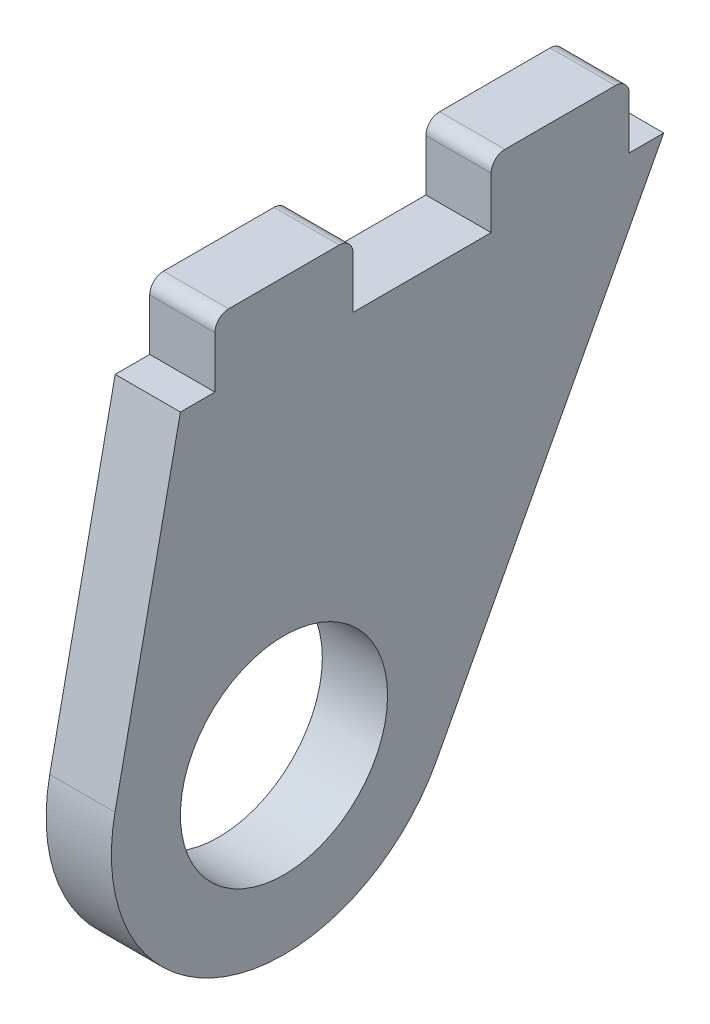
ISO-10303-21;
HEADER;
FILE_DESCRIPTION(('STEP AP214'),'2;1');
FILE_NAME('part.step','',(''),(''),'','','');
FILE_SCHEMA(('AUTOMOTIVE_DESIGN { 1 0 10303 214 1 1 1 1 }'));
ENDSEC;
DATA;
#1=APPLICATION_CONTEXT('core data for automotive mechanical design processes');
#2=APPLICATION_PROTOCOL_DEFINITION('international standard','automotive_design',2000,#1);
#3=PRODUCT_CONTEXT('',#1,'mechanical');
#4=PRODUCT('Part','Part','',(#3));
#5=PRODUCT_RELATED_PRODUCT_CATEGORY('part','',(#4));
#6=PRODUCT_DEFINITION_FORMATION('','',#4);
#7=PRODUCT_DEFINITION_CONTEXT('part definition',#1,'design');
#8=PRODUCT_DEFINITION('design','',#6,#7);
#9=PRODUCT_DEFINITION_SHAPE('','',#8);
#10=(LENGTH_UNIT() NAMED_UNIT(*) SI_UNIT(.MILLI.,.METRE.));
#11=(NAMED_UNIT(*) PLANE_ANGLE_UNIT() SI_UNIT($,.RADIAN.));
#12=(NAMED_UNIT(*) SI_UNIT($,.STERADIAN.) SOLID_ANGLE_UNIT());
#13=UNCERTAINTY_MEASURE_WITH_UNIT(LENGTH_MEASURE(1.E-05),#10,'distance_accuracy_value','');
#14=(GEOMETRIC_REPRESENTATION_CONTEXT(3) GLOBAL_UNCERTAINTY_ASSIGNED_CONTEXT((#13)) GLOBAL_UNIT_ASSIGNED_CONTEXT((#10,
#11,#12)) REPRESENTATION_CONTEXT('',''));
#15=CARTESIAN_POINT('',(0.,0.,0.));
#16=DIRECTION('',(0.,0.,1.));
#17=DIRECTION('',(1.,0.,0.));
#18=AXIS2_PLACEMENT_3D('',#15,#16,#17);
#19=CARTESIAN_POINT('',(3.,32.1,9.525));
#20=DIRECTION('',(0.,-1.,0.));
#21=DIRECTION('',(0.,0.,-1.));
#22=AXIS2_PLACEMENT_3D('',#19,#20,#21);
#23=PLANE('',#22);
#24=DIRECTION('',(-1.,0.,0.));
#25=VECTOR('',#24,1.);
#26=CARTESIAN_POINT('',(-3.,32.1,-31.75));
#27=LINE('',#26,#25);
#28=CARTESIAN_POINT('',(3.,32.1,-31.75));
#29=VERTEX_POINT('',#28);
#30=CARTESIAN_POINT('',(-3.,32.1,-31.75));
#31=VERTEX_POINT('',#30);
#32=EDGE_CURVE('E190',#29,#31,#27,.T.);
#33=ORIENTED_EDGE('',*,*,#32,.F.);
#34=DIRECTION('',(0.,0.,1.));
#35=VECTOR('',#34,1.);
#36=CARTESIAN_POINT('',(3.,32.1,9.525));
#37=LINE('',#36,#35);
#38=CARTESIAN_POINT('',(3.,32.1,-34.925));
#39=VERTEX_POINT('',#38);
#40=EDGE_CURVE('E253',#39,#29,#37,.T.);
#41=ORIENTED_EDGE('',*,*,#40,.F.);
#42=DIRECTION('',(-1.,0.,0.));
#43=VECTOR('',#42,1.);
#44=CARTESIAN_POINT('',(3.,32.1,-34.925));
#45=LINE('',#44,#43);
#46=CARTESIAN_POINT('',(-3.,32.1,-34.925));
#47=VERTEX_POINT('',#46);
#48=EDGE_CURVE('E278',#39,#47,#45,.T.);
#49=ORIENTED_EDGE('',*,*,#48,.T.);
#50=DIRECTION('',(0.,0.,1.));
#51=VECTOR('',#50,1.);
#52=CARTESIAN_POINT('',(-3.,32.1,9.525));
#53=LINE('',#52,#51);
#54=EDGE_CURVE('E182',#47,#31,#53,.T.);
#55=ORIENTED_EDGE('',*,*,#54,.T.);
#56=EDGE_LOOP('',(#33,#41,#49,#55));
#57=FACE_BOUND('',#56,.T.);
#58=ADVANCED_FACE('F45',(#57),#23,.F.);
#59=DIRECTION('',(1.,0.,0.));
#60=VECTOR('',#59,1.);
#61=CARTESIAN_POINT('',(-3.,32.1,-19.05));
#62=LINE('',#61,#60);
#63=CARTESIAN_POINT('',(-3.,32.1,-19.05));
#64=VERTEX_POINT('',#63);
#65=CARTESIAN_POINT('',(3.,32.1,-19.05));
#66=VERTEX_POINT('',#65);
#67=EDGE_CURVE('E163',#64,#66,#62,.T.);
#68=ORIENTED_EDGE('',*,*,#67,.F.);
#69=CARTESIAN_POINT('',(-3.,32.1,-6.35));
#70=VERTEX_POINT('',#69);
#71=EDGE_CURVE('E172',#64,#70,#53,.T.);
#72=ORIENTED_EDGE('',*,*,#71,.T.);
#73=DIRECTION('',(-1.,0.,0.));
#74=VECTOR('',#73,1.);
#75=CARTESIAN_POINT('',(-3.,32.1,-6.35));
#76=LINE('',#75,#74);
#77=CARTESIAN_POINT('',(3.,32.1,-6.35));
#78=VERTEX_POINT('',#77);
#79=EDGE_CURVE('E208',#78,#70,#76,.T.);
#80=ORIENTED_EDGE('',*,*,#79,.F.);
#81=EDGE_CURVE('E187',#66,#78,#37,.T.);
#82=ORIENTED_EDGE('',*,*,#81,.F.);
#83=EDGE_LOOP('',(#68,#72,#80,#82));
#84=FACE_BOUND('',#83,.T.);
#85=ADVANCED_FACE('F186',(#84),#23,.F.);
#86=DIRECTION('',(1.,0.,0.));
#87=VECTOR('',#86,1.);
#88=CARTESIAN_POINT('',(-3.,32.1,6.35));
#89=LINE('',#88,#87);
#90=CARTESIAN_POINT('',(-3.,32.1,6.35));
#91=VERTEX_POINT('',#90);
#92=CARTESIAN_POINT('',(3.,32.1,6.35));
#93=VERTEX_POINT('',#92);
#94=EDGE_CURVE('E214',#91,#93,#89,.T.);
#95=ORIENTED_EDGE('',*,*,#94,.F.);
#96=CARTESIAN_POINT('',(-3.,32.1,9.525));
#97=VERTEX_POINT('',#96);
#98=EDGE_CURVE('E183',#91,#97,#53,.T.);
#99=ORIENTED_EDGE('',*,*,#98,.T.);
#100=DIRECTION('',(-1.,0.,0.));
#101=VECTOR('',#100,1.);
#102=CARTESIAN_POINT('',(3.,32.1,9.525));
#103=LINE('',#102,#101);
#104=CARTESIAN_POINT('',(3.,32.1,9.525));
#105=VERTEX_POINT('',#104);
#106=EDGE_CURVE('E274',#105,#97,#103,.T.);
#107=ORIENTED_EDGE('',*,*,#106,.F.);
#108=EDGE_CURVE('E252',#93,#105,#37,.T.);
#109=ORIENTED_EDGE('',*,*,#108,.F.);
#110=EDGE_LOOP('',(#95,#99,#107,#109));
#111=FACE_BOUND('',#110,.T.);
#112=ADVANCED_FACE('F373',(#111),#23,.F.);
#113=CARTESIAN_POINT('',(3.,0.,0.));
#114=DIRECTION('',(1.,0.,0.));
#115=DIRECTION('',(0.,0.,-1.));
#116=AXIS2_PLACEMENT_3D('',#113,#114,#115);
#117=PLANE('',#116);
#118=DIRECTION('',(0.,-1.,0.));
#119=VECTOR('',#118,1.);
#120=CARTESIAN_POINT('',(3.,38.1,-31.75));
#121=LINE('',#120,#119);
#122=CARTESIAN_POINT('',(3.,36.83,-31.75));
#123=VERTEX_POINT('',#122);
#124=EDGE_CURVE('E205',#123,#29,#121,.T.);
#125=ORIENTED_EDGE('',*,*,#124,.F.);
#126=CARTESIAN_POINT('',(3.,36.83,-30.48));
#127=DIRECTION('',(1.,0.,0.));
#128=DIRECTION('',(0.,0.,-1.));
#129=AXIS2_PLACEMENT_3D('',#126,#127,#128);
#130=CIRCLE('',#129,1.27);
#131=CARTESIAN_POINT('',(3.,38.1,-30.48));
#132=VERTEX_POINT('',#131);
#133=EDGE_CURVE('E54',#123,#132,#130,.T.);
#134=ORIENTED_EDGE('',*,*,#133,.T.);
#135=DIRECTION('',(0.,0.,-1.));
#136=VECTOR('',#135,1.);
#137=CARTESIAN_POINT('',(3.,38.1,-19.05));
#138=LINE('',#137,#136);
#139=CARTESIAN_POINT('',(3.,38.1,-20.32));
#140=VERTEX_POINT('',#139);
#141=EDGE_CURVE('E189',#140,#132,#138,.T.);
#142=ORIENTED_EDGE('',*,*,#141,.F.);
#143=CARTESIAN_POINT('',(3.,36.83,-20.32));
#144=DIRECTION('',(1.,0.,0.));
#145=DIRECTION('',(0.,0.,-1.));
#146=AXIS2_PLACEMENT_3D('',#143,#144,#145);
#147=CIRCLE('',#146,1.27);
#148=CARTESIAN_POINT('',(3.,36.83,-19.05));
#149=VERTEX_POINT('',#148);
#150=EDGE_CURVE('E61',#140,#149,#147,.T.);
#151=ORIENTED_EDGE('',*,*,#150,.T.);
#152=DIRECTION('',(0.,-1.,0.));
#153=VECTOR('',#152,1.);
#154=CARTESIAN_POINT('',(3.,38.1,-19.05));
#155=LINE('',#154,#153);
#156=EDGE_CURVE('E169',#149,#66,#155,.T.);
#157=ORIENTED_EDGE('',*,*,#156,.T.);
#158=ORIENTED_EDGE('',*,*,#81,.T.);
#159=DIRECTION('',(0.,-1.,0.));
#160=VECTOR('',#159,1.);
#161=CARTESIAN_POINT('',(3.,38.1,-6.35));
#162=LINE('',#161,#160);
#163=CARTESIAN_POINT('',(3.,36.83,-6.35));
#164=VERTEX_POINT('',#163);
#165=EDGE_CURVE('E231',#164,#78,#162,.T.);
#166=ORIENTED_EDGE('',*,*,#165,.F.);
#167=CARTESIAN_POINT('',(3.,36.83,-5.08));
#168=DIRECTION('',(1.,0.,0.));
#169=DIRECTION('',(0.,0.,-1.));
#170=AXIS2_PLACEMENT_3D('',#167,#168,#169);
#171=CIRCLE('',#170,1.27);
#172=CARTESIAN_POINT('',(3.,38.1,-5.08));
#173=VERTEX_POINT('',#172);
#174=EDGE_CURVE('E306',#164,#173,#171,.T.);
#175=ORIENTED_EDGE('',*,*,#174,.T.);
#176=DIRECTION('',(0.,0.,-1.));
#177=VECTOR('',#176,1.);
#178=CARTESIAN_POINT('',(3.,38.1,6.35));
#179=LINE('',#178,#177);
#180=CARTESIAN_POINT('',(3.,38.1,5.08));
#181=VERTEX_POINT('',#180);
#182=EDGE_CURVE('E209',#181,#173,#179,.T.);
#183=ORIENTED_EDGE('',*,*,#182,.F.);
#184=CARTESIAN_POINT('',(3.,36.83,5.08));
#185=DIRECTION('',(1.,0.,0.));
#186=DIRECTION('',(0.,0.,-1.));
#187=AXIS2_PLACEMENT_3D('',#184,#185,#186);
#188=CIRCLE('',#187,1.27);
#189=CARTESIAN_POINT('',(3.,36.83,6.35));
#190=VERTEX_POINT('',#189);
#191=EDGE_CURVE('E303',#181,#190,#188,.T.);
#192=ORIENTED_EDGE('',*,*,#191,.T.);
#193=DIRECTION('',(0.,-1.,0.));
#194=VECTOR('',#193,1.);
#195=CARTESIAN_POINT('',(3.,38.1,6.35));
#196=LINE('',#195,#194);
#197=EDGE_CURVE('E218',#190,#93,#196,.T.);
#198=ORIENTED_EDGE('',*,*,#197,.T.);
#199=ORIENTED_EDGE('',*,*,#108,.T.);
#200=DIRECTION('',(0.,-0.978957723054488,0.204063167847539));
#201=VECTOR('',#200,1.);
#202=CARTESIAN_POINT('',(3.,3.23950278957968,15.54095385349));
#203=LINE('',#202,#201);
#204=CARTESIAN_POINT('',(3.,3.23950278957968,15.54095385349));
#205=VERTEX_POINT('',#204);
#206=EDGE_CURVE('E257',#105,#205,#203,.T.);
#207=ORIENTED_EDGE('',*,*,#206,.T.);
#208=CARTESIAN_POINT('',(3.,0.,0.));
#209=DIRECTION('',(1.,0.,0.));
#210=DIRECTION('',(0.,0.,-1.));
#211=AXIS2_PLACEMENT_3D('',#208,#209,#210);
#212=CIRCLE('',#211,15.875);
#213=CARTESIAN_POINT('',(3.,-7.4189592603051,-14.0347664210678));
#214=VERTEX_POINT('',#213);
#215=EDGE_CURVE('E244',#205,#214,#212,.T.);
#216=ORIENTED_EDGE('',*,*,#215,.T.);
#217=DIRECTION('',(0.,0.884079774555454,-0.467336016397172));
#218=VECTOR('',#217,1.);
#219=CARTESIAN_POINT('',(3.,-7.4189592603051,-14.0347664210678));
#220=LINE('',#219,#218);
#221=EDGE_CURVE('E248',#214,#39,#220,.T.);
#222=ORIENTED_EDGE('',*,*,#221,.T.);
#223=ORIENTED_EDGE('',*,*,#40,.T.);
#224=EDGE_LOOP('',(#125,#134,#142,#151,#157,#158,#166,#175,#183,#192,#198,#199,#207,#216,#222,#223));
#225=FACE_BOUND('',#224,.T.);
#226=CARTESIAN_POINT('',(3.,0.,0.));
#227=DIRECTION('',(1.,0.,0.));
#228=DIRECTION('',(0.,0.,-1.));
#229=AXIS2_PLACEMENT_3D('',#226,#227,#228);
#230=CIRCLE('',#229,9.525);
#231=CARTESIAN_POINT('',(3.,0.,-9.525));
#232=VERTEX_POINT('',#231);
#233=EDGE_CURVE('E236',#232,#232,#230,.T.);
#234=ORIENTED_EDGE('',*,*,#233,.F.);
#235=EDGE_LOOP('',(#234));
#236=FACE_BOUND('',#235,.T.);
#237=ADVANCED_FACE('F331',(#225,#236),#117,.T.);
#238=CARTESIAN_POINT('',(-3.,0.,0.));
#239=DIRECTION('',(1.,0.,0.));
#240=DIRECTION('',(0.,0.,-1.));
#241=AXIS2_PLACEMENT_3D('',#238,#239,#240);
#242=PLANE('',#241);
#243=DIRECTION('',(0.,0.,1.));
#244=VECTOR('',#243,1.);
#245=CARTESIAN_POINT('',(-3.,38.1,-19.05));
#246=LINE('',#245,#244);
#247=CARTESIAN_POINT('',(-3.,38.1,-30.48));
#248=VERTEX_POINT('',#247);
#249=CARTESIAN_POINT('',(-3.,38.1,-20.32));
#250=VERTEX_POINT('',#249);
#251=EDGE_CURVE('E195',#248,#250,#246,.T.);
#252=ORIENTED_EDGE('',*,*,#251,.F.);
#253=CARTESIAN_POINT('',(-3.,36.83,-30.48));
#254=DIRECTION('',(1.,0.,0.));
#255=DIRECTION('',(0.,0.,-1.));
#256=AXIS2_PLACEMENT_3D('',#253,#254,#255);
#257=CIRCLE('',#256,1.27);
#258=CARTESIAN_POINT('',(-3.,36.83,-31.75));
#259=VERTEX_POINT('',#258);
#260=EDGE_CURVE('E323',#248,#259,#257,.F.);
#261=ORIENTED_EDGE('',*,*,#260,.T.);
#262=DIRECTION('',(0.,-1.,0.));
#263=VECTOR('',#262,1.);
#264=CARTESIAN_POINT('',(-3.,38.1,-31.75));
#265=LINE('',#264,#263);
#266=EDGE_CURVE('E168',#259,#31,#265,.T.);
#267=ORIENTED_EDGE('',*,*,#266,.T.);
#268=ORIENTED_EDGE('',*,*,#54,.F.);
#269=DIRECTION('',(0.,0.884079774555454,-0.467336016397172));
#270=VECTOR('',#269,1.);
#271=CARTESIAN_POINT('',(-3.,-7.4189592603051,-14.0347664210678));
#272=LINE('',#271,#270);
#273=CARTESIAN_POINT('',(-3.,-7.4189592603051,-14.0347664210678));
#274=VERTEX_POINT('',#273);
#275=EDGE_CURVE('E264',#274,#47,#272,.T.);
#276=ORIENTED_EDGE('',*,*,#275,.F.);
#277=CARTESIAN_POINT('',(-3.,0.,0.));
#278=DIRECTION('',(1.,0.,0.));
#279=DIRECTION('',(0.,0.,-1.));
#280=AXIS2_PLACEMENT_3D('',#277,#278,#279);
#281=CIRCLE('',#280,15.875);
#282=CARTESIAN_POINT('',(-3.,3.23950278957968,15.54095385349));
#283=VERTEX_POINT('',#282);
#284=EDGE_CURVE('E240',#283,#274,#281,.T.);
#285=ORIENTED_EDGE('',*,*,#284,.F.);
#286=DIRECTION('',(0.,-0.978957723054488,0.204063167847539));
#287=VECTOR('',#286,1.);
#288=CARTESIAN_POINT('',(-3.,3.23950278957968,15.54095385349));
#289=LINE('',#288,#287);
#290=EDGE_CURVE('E249',#97,#283,#289,.T.);
#291=ORIENTED_EDGE('',*,*,#290,.F.);
#292=ORIENTED_EDGE('',*,*,#98,.F.);
#293=DIRECTION('',(0.,-1.,0.));
#294=VECTOR('',#293,1.);
#295=CARTESIAN_POINT('',(-3.,38.1,6.35));
#296=LINE('',#295,#294);
#297=CARTESIAN_POINT('',(-3.,36.83,6.35));
#298=VERTEX_POINT('',#297);
#299=EDGE_CURVE('E226',#298,#91,#296,.T.);
#300=ORIENTED_EDGE('',*,*,#299,.F.);
#301=CARTESIAN_POINT('',(-3.,36.83,5.08));
#302=DIRECTION('',(1.,0.,0.));
#303=DIRECTION('',(0.,0.,-1.));
#304=AXIS2_PLACEMENT_3D('',#301,#302,#303);
#305=CIRCLE('',#304,1.27);
#306=CARTESIAN_POINT('',(-3.,38.1,5.08));
#307=VERTEX_POINT('',#306);
#308=EDGE_CURVE('E294',#298,#307,#305,.F.);
#309=ORIENTED_EDGE('',*,*,#308,.T.);
#310=DIRECTION('',(0.,0.,1.));
#311=VECTOR('',#310,1.);
#312=CARTESIAN_POINT('',(-3.,38.1,6.35));
#313=LINE('',#312,#311);
#314=CARTESIAN_POINT('',(-3.,38.1,-5.08));
#315=VERTEX_POINT('',#314);
#316=EDGE_CURVE('E213',#315,#307,#313,.T.);
#317=ORIENTED_EDGE('',*,*,#316,.F.);
#318=CARTESIAN_POINT('',(-3.,36.83,-5.08));
#319=DIRECTION('',(1.,0.,0.));
#320=DIRECTION('',(0.,0.,-1.));
#321=AXIS2_PLACEMENT_3D('',#318,#319,#320);
#322=CIRCLE('',#321,1.27);
#323=CARTESIAN_POINT('',(-3.,36.83,-6.35));
#324=VERTEX_POINT('',#323);
#325=EDGE_CURVE('E297',#315,#324,#322,.F.);
#326=ORIENTED_EDGE('',*,*,#325,.T.);
#327=DIRECTION('',(0.,-1.,0.));
#328=VECTOR('',#327,1.);
#329=CARTESIAN_POINT('',(-3.,38.1,-6.35));
#330=LINE('',#329,#328);
#331=EDGE_CURVE('E177',#324,#70,#330,.T.);
#332=ORIENTED_EDGE('',*,*,#331,.T.);
#333=ORIENTED_EDGE('',*,*,#71,.F.);
#334=DIRECTION('',(0.,-1.,0.));
#335=VECTOR('',#334,1.);
#336=CARTESIAN_POINT('',(-3.,38.1,-19.05));
#337=LINE('',#336,#335);
#338=CARTESIAN_POINT('',(-3.,36.83,-19.05));
#339=VERTEX_POINT('',#338);
#340=EDGE_CURVE('E159',#339,#64,#337,.T.);
#341=ORIENTED_EDGE('',*,*,#340,.F.);
#342=CARTESIAN_POINT('',(-3.,36.83,-20.32));
#343=DIRECTION('',(1.,0.,0.));
#344=DIRECTION('',(0.,0.,-1.));
#345=AXIS2_PLACEMENT_3D('',#342,#343,#344);
#346=CIRCLE('',#345,1.27);
#347=EDGE_CURVE('E320',#339,#250,#346,.F.);
#348=ORIENTED_EDGE('',*,*,#347,.T.);
#349=EDGE_LOOP('',(#252,#261,#267,#268,#276,#285,#291,#292,#300,#309,#317,#326,#332,#333,#341,#348));
#350=FACE_BOUND('',#349,.T.);
#351=CARTESIAN_POINT('',(-3.,0.,0.));
#352=DIRECTION('',(1.,0.,0.));
#353=DIRECTION('',(0.,0.,-1.));
#354=AXIS2_PLACEMENT_3D('',#351,#352,#353);
#355=CIRCLE('',#354,9.525);
#356=CARTESIAN_POINT('',(-3.,0.,-9.525));
#357=VERTEX_POINT('',#356);
#358=EDGE_CURVE('E235',#357,#357,#355,.T.);
#359=ORIENTED_EDGE('',*,*,#358,.T.);
#360=EDGE_LOOP('',(#359));
#361=FACE_BOUND('',#360,.T.);
#362=ADVANCED_FACE('F174',(#350,#361),#242,.F.);
#363=CARTESIAN_POINT('',(3.,0.,0.));
#364=DIRECTION('',(-1.,0.,0.));
#365=DIRECTION('',(0.,0.,1.));
#366=AXIS2_PLACEMENT_3D('',#363,#364,#365);
#367=CYLINDRICAL_SURFACE('',#366,15.875);
#368=ORIENTED_EDGE('',*,*,#284,.T.);
#369=DIRECTION('',(-1.,0.,0.));
#370=VECTOR('',#369,1.);
#371=CARTESIAN_POINT('',(3.,-7.4189592603051,-14.0347664210678));
#372=LINE('',#371,#370);
#373=EDGE_CURVE('E282',#214,#274,#372,.T.);
#374=ORIENTED_EDGE('',*,*,#373,.F.);
#375=ORIENTED_EDGE('',*,*,#215,.F.);
#376=DIRECTION('',(-1.,0.,0.));
#377=VECTOR('',#376,1.);
#378=CARTESIAN_POINT('',(3.,3.23950278957968,15.54095385349));
#379=LINE('',#378,#377);
#380=EDGE_CURVE('E260',#205,#283,#379,.T.);
#381=ORIENTED_EDGE('',*,*,#380,.T.);
#382=EDGE_LOOP('',(#368,#374,#375,#381));
#383=FACE_BOUND('',#382,.T.);
#384=ADVANCED_FACE('F353',(#383),#367,.T.);
#385=CARTESIAN_POINT('',(3.,-7.4189592603051,-14.0347664210678));
#386=DIRECTION('',(0.,0.467336016397172,0.884079774555454));
#387=DIRECTION('',(0.,-0.884079774555454,0.467336016397172));
#388=AXIS2_PLACEMENT_3D('',#385,#386,#387);
#389=PLANE('',#388);
#390=ORIENTED_EDGE('',*,*,#275,.T.);
#391=ORIENTED_EDGE('',*,*,#48,.F.);
#392=ORIENTED_EDGE('',*,*,#221,.F.);
#393=ORIENTED_EDGE('',*,*,#373,.T.);
#394=EDGE_LOOP('',(#390,#391,#392,#393));
#395=FACE_BOUND('',#394,.T.);
#396=ADVANCED_FACE('F349',(#395),#389,.F.);
#397=CARTESIAN_POINT('',(3.,3.23950278957968,15.54095385349));
#398=DIRECTION('',(0.,-0.204063167847539,-0.978957723054488));
#399=DIRECTION('',(0.,0.978957723054488,-0.204063167847539));
#400=AXIS2_PLACEMENT_3D('',#397,#398,#399);
#401=PLANE('',#400);
#402=ORIENTED_EDGE('',*,*,#290,.T.);
#403=ORIENTED_EDGE('',*,*,#380,.F.);
#404=ORIENTED_EDGE('',*,*,#206,.F.);
#405=ORIENTED_EDGE('',*,*,#106,.T.);
#406=EDGE_LOOP('',(#402,#403,#404,#405));
#407=FACE_BOUND('',#406,.T.);
#408=ADVANCED_FACE('F357',(#407),#401,.F.);
#409=CARTESIAN_POINT('',(3.,0.,0.));
#410=DIRECTION('',(-1.,0.,0.));
#411=DIRECTION('',(0.,0.,1.));
#412=AXIS2_PLACEMENT_3D('',#409,#410,#411);
#413=CYLINDRICAL_SURFACE('',#412,9.525);
#414=ORIENTED_EDGE('',*,*,#233,.T.);
#415=EDGE_LOOP('',(#414));
#416=FACE_BOUND('',#415,.T.);
#417=ORIENTED_EDGE('',*,*,#358,.F.);
#418=EDGE_LOOP('',(#417));
#419=FACE_BOUND('',#418,.T.);
#420=ADVANCED_FACE('F409',(#416,#419),#413,.F.);
#421=CARTESIAN_POINT('',(-3.,38.1,-6.35));
#422=DIRECTION('',(0.,0.,1.));
#423=DIRECTION('',(1.,0.,0.));
#424=AXIS2_PLACEMENT_3D('',#421,#422,#423);
#425=PLANE('',#424);
#426=ORIENTED_EDGE('',*,*,#331,.F.);
#427=DIRECTION('',(-1.,0.,0.));
#428=VECTOR('',#427,1.);
#429=CARTESIAN_POINT('',(-3.,36.83,-6.35));
#430=LINE('',#429,#428);
#431=EDGE_CURVE('E300',#324,#164,#430,.F.);
#432=ORIENTED_EDGE('',*,*,#431,.T.);
#433=ORIENTED_EDGE('',*,*,#165,.T.);
#434=ORIENTED_EDGE('',*,*,#79,.T.);
#435=EDGE_LOOP('',(#426,#432,#433,#434));
#436=FACE_BOUND('',#435,.T.);
#437=ADVANCED_FACE('F405',(#436),#425,.F.);
#438=CARTESIAN_POINT('',(-3.,38.1,6.35));
#439=DIRECTION('',(0.,0.,-1.));
#440=DIRECTION('',(-1.,0.,0.));
#441=AXIS2_PLACEMENT_3D('',#438,#439,#440);
#442=PLANE('',#441);
#443=ORIENTED_EDGE('',*,*,#197,.F.);
#444=DIRECTION('',(1.,0.,0.));
#445=VECTOR('',#444,1.);
#446=CARTESIAN_POINT('',(-3.,36.83,6.35));
#447=LINE('',#446,#445);
#448=EDGE_CURVE('E309',#190,#298,#447,.F.);
#449=ORIENTED_EDGE('',*,*,#448,.T.);
#450=ORIENTED_EDGE('',*,*,#299,.T.);
#451=ORIENTED_EDGE('',*,*,#94,.T.);
#452=EDGE_LOOP('',(#443,#449,#450,#451));
#453=FACE_BOUND('',#452,.T.);
#454=ADVANCED_FACE('F390',(#453),#442,.F.);
#455=CARTESIAN_POINT('',(0.,38.1,0.));
#456=DIRECTION('',(0.,-1.,0.));
#457=DIRECTION('',(0.,0.,-1.));
#458=AXIS2_PLACEMENT_3D('',#455,#456,#457);
#459=PLANE('',#458);
#460=ORIENTED_EDGE('',*,*,#182,.T.);
#461=DIRECTION('',(-1.,0.,0.));
#462=VECTOR('',#461,1.);
#463=CARTESIAN_POINT('',(0.,38.1,-5.08));
#464=LINE('',#463,#462);
#465=EDGE_CURVE('E290',#173,#315,#464,.T.);
#466=ORIENTED_EDGE('',*,*,#465,.T.);
#467=ORIENTED_EDGE('',*,*,#316,.T.);
#468=DIRECTION('',(1.,0.,0.));
#469=VECTOR('',#468,1.);
#470=CARTESIAN_POINT('',(0.,38.1,5.08));
#471=LINE('',#470,#469);
#472=EDGE_CURVE('E286',#307,#181,#471,.T.);
#473=ORIENTED_EDGE('',*,*,#472,.T.);
#474=EDGE_LOOP('',(#460,#466,#467,#473));
#475=FACE_BOUND('',#474,.T.);
#476=ADVANCED_FACE('F397',(#475),#459,.F.);
#477=CARTESIAN_POINT('',(0.,36.83,-5.08));
#478=DIRECTION('',(-1.,0.,0.));
#479=DIRECTION('',(0.,0.,1.));
#480=AXIS2_PLACEMENT_3D('',#477,#478,#479);
#481=CYLINDRICAL_SURFACE('',#480,1.27);
#482=ORIENTED_EDGE('',*,*,#174,.F.);
#483=ORIENTED_EDGE('',*,*,#431,.F.);
#484=ORIENTED_EDGE('',*,*,#325,.F.);
#485=ORIENTED_EDGE('',*,*,#465,.F.);
#486=EDGE_LOOP('',(#482,#483,#484,#485));
#487=FACE_BOUND('',#486,.T.);
#488=ADVANCED_FACE('F402',(#487),#481,.T.);
#489=CARTESIAN_POINT('',(0.,36.83,5.08));
#490=DIRECTION('',(1.,0.,0.));
#491=DIRECTION('',(0.,0.,-1.));
#492=AXIS2_PLACEMENT_3D('',#489,#490,#491);
#493=CYLINDRICAL_SURFACE('',#492,1.27);
#494=ORIENTED_EDGE('',*,*,#308,.F.);
#495=ORIENTED_EDGE('',*,*,#448,.F.);
#496=ORIENTED_EDGE('',*,*,#191,.F.);
#497=ORIENTED_EDGE('',*,*,#472,.F.);
#498=EDGE_LOOP('',(#494,#495,#496,#497));
#499=FACE_BOUND('',#498,.T.);
#500=ADVANCED_FACE('F393',(#499),#493,.T.);
#501=CARTESIAN_POINT('',(-3.,38.1,-31.75));
#502=DIRECTION('',(0.,0.,1.));
#503=DIRECTION('',(1.,0.,0.));
#504=AXIS2_PLACEMENT_3D('',#501,#502,#503);
#505=PLANE('',#504);
#506=ORIENTED_EDGE('',*,*,#266,.F.);
#507=DIRECTION('',(-1.,0.,0.));
#508=VECTOR('',#507,1.);
#509=CARTESIAN_POINT('',(-3.,36.83,-31.75));
#510=LINE('',#509,#508);
#511=EDGE_CURVE('E69',#259,#123,#510,.F.);
#512=ORIENTED_EDGE('',*,*,#511,.T.);
#513=ORIENTED_EDGE('',*,*,#124,.T.);
#514=ORIENTED_EDGE('',*,*,#32,.T.);
#515=EDGE_LOOP('',(#506,#512,#513,#514));
#516=FACE_BOUND('',#515,.T.);
#517=ADVANCED_FACE('F341',(#516),#505,.F.);
#518=CARTESIAN_POINT('',(-3.,38.1,-19.05));
#519=DIRECTION('',(0.,0.,-1.));
#520=DIRECTION('',(-1.,0.,0.));
#521=AXIS2_PLACEMENT_3D('',#518,#519,#520);
#522=PLANE('',#521);
#523=ORIENTED_EDGE('',*,*,#156,.F.);
#524=DIRECTION('',(1.,0.,0.));
#525=VECTOR('',#524,1.);
#526=CARTESIAN_POINT('',(-3.,36.83,-19.05));
#527=LINE('',#526,#525);
#528=EDGE_CURVE('E11',#149,#339,#527,.F.);
#529=ORIENTED_EDGE('',*,*,#528,.T.);
#530=ORIENTED_EDGE('',*,*,#340,.T.);
#531=ORIENTED_EDGE('',*,*,#67,.T.);
#532=EDGE_LOOP('',(#523,#529,#530,#531));
#533=FACE_BOUND('',#532,.T.);
#534=ADVANCED_FACE('F161',(#533),#522,.F.);
#535=CARTESIAN_POINT('',(0.,38.1,-25.4));
#536=DIRECTION('',(0.,-1.,0.));
#537=DIRECTION('',(0.,0.,-1.));
#538=AXIS2_PLACEMENT_3D('',#535,#536,#537);
#539=PLANE('',#538);
#540=ORIENTED_EDGE('',*,*,#141,.T.);
#541=DIRECTION('',(-1.,0.,0.));
#542=VECTOR('',#541,1.);
#543=CARTESIAN_POINT('',(0.,38.1,-30.48));
#544=LINE('',#543,#542);
#545=EDGE_CURVE('E316',#132,#248,#544,.T.);
#546=ORIENTED_EDGE('',*,*,#545,.T.);
#547=ORIENTED_EDGE('',*,*,#251,.T.);
#548=DIRECTION('',(1.,0.,0.));
#549=VECTOR('',#548,1.);
#550=CARTESIAN_POINT('',(0.,38.1,-20.32));
#551=LINE('',#550,#549);
#552=EDGE_CURVE('E312',#250,#140,#551,.T.);
#553=ORIENTED_EDGE('',*,*,#552,.T.);
#554=EDGE_LOOP('',(#540,#546,#547,#553));
#555=FACE_BOUND('',#554,.T.);
#556=ADVANCED_FACE('F336',(#555),#539,.F.);
#557=CARTESIAN_POINT('',(0.,36.83,-30.48));
#558=DIRECTION('',(-1.,0.,0.));
#559=DIRECTION('',(0.,0.,1.));
#560=AXIS2_PLACEMENT_3D('',#557,#558,#559);
#561=CYLINDRICAL_SURFACE('',#560,1.27);
#562=ORIENTED_EDGE('',*,*,#133,.F.);
#563=ORIENTED_EDGE('',*,*,#511,.F.);
#564=ORIENTED_EDGE('',*,*,#260,.F.);
#565=ORIENTED_EDGE('',*,*,#545,.F.);
#566=EDGE_LOOP('',(#562,#563,#564,#565));
#567=FACE_BOUND('',#566,.T.);
#568=ADVANCED_FACE('F339',(#567),#561,.T.);
#569=CARTESIAN_POINT('',(0.,36.83,-20.32));
#570=DIRECTION('',(1.,0.,0.));
#571=DIRECTION('',(0.,0.,-1.));
#572=AXIS2_PLACEMENT_3D('',#569,#570,#571);
#573=CYLINDRICAL_SURFACE('',#572,1.27);
#574=ORIENTED_EDGE('',*,*,#347,.F.);
#575=ORIENTED_EDGE('',*,*,#528,.F.);
#576=ORIENTED_EDGE('',*,*,#150,.F.);
#577=ORIENTED_EDGE('',*,*,#552,.F.);
#578=EDGE_LOOP('',(#574,#575,#576,#577));
#579=FACE_BOUND('',#578,.T.);
#580=ADVANCED_FACE('F47',(#579),#573,.T.);
#581=CLOSED_SHELL('',(#58,#85,#112,#237,#362,#384,#396,#408,#420,#437,#454,#476,#488,#500,#517,
#534,#556,#568,#580));
#582=MANIFOLD_SOLID_BREP('B2',#581);
#583=ADVANCED_BREP_SHAPE_REPRESENTATION('',(#18,#582),#14);
#584=SHAPE_DEFINITION_REPRESENTATION(#9,#583);
ENDSEC;
END-ISO-10303-21;
